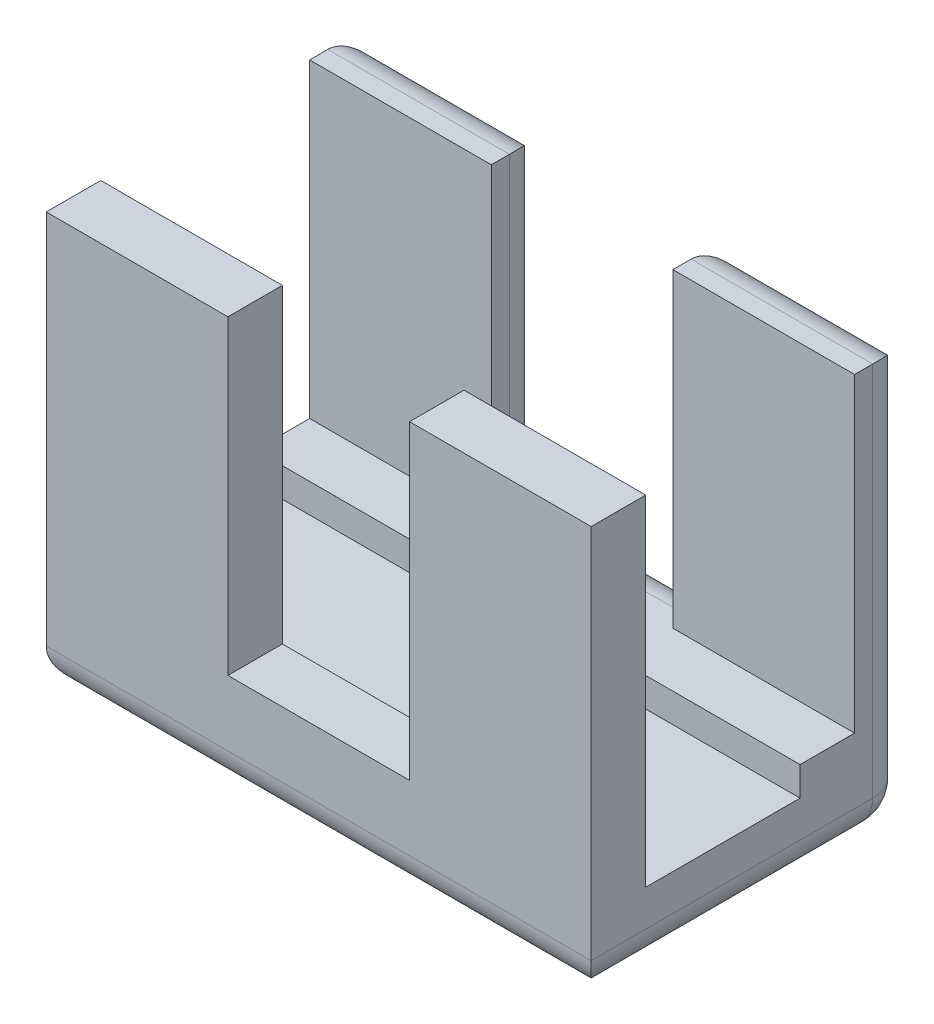
ISO-10303-21;
HEADER;
FILE_DESCRIPTION(('STEP AP214'),'2;1');
FILE_NAME('part.step','',(''),(''),'','','');
FILE_SCHEMA(('AUTOMOTIVE_DESIGN { 1 0 10303 214 1 1 1 1 }'));
ENDSEC;
DATA;
#1=APPLICATION_CONTEXT('core data for automotive mechanical design processes');
#2=APPLICATION_PROTOCOL_DEFINITION('international standard','automotive_design',2000,#1);
#3=PRODUCT_CONTEXT('',#1,'mechanical');
#4=PRODUCT('Part','Part','',(#3));
#5=PRODUCT_RELATED_PRODUCT_CATEGORY('part','',(#4));
#6=PRODUCT_DEFINITION_FORMATION('','',#4);
#7=PRODUCT_DEFINITION_CONTEXT('part definition',#1,'design');
#8=PRODUCT_DEFINITION('design','',#6,#7);
#9=PRODUCT_DEFINITION_SHAPE('','',#8);
#10=(LENGTH_UNIT() NAMED_UNIT(*) SI_UNIT(.MILLI.,.METRE.));
#11=(NAMED_UNIT(*) PLANE_ANGLE_UNIT() SI_UNIT($,.RADIAN.));
#12=(NAMED_UNIT(*) SI_UNIT($,.STERADIAN.) SOLID_ANGLE_UNIT());
#13=UNCERTAINTY_MEASURE_WITH_UNIT(LENGTH_MEASURE(1.E-05),#10,'distance_accuracy_value','');
#14=(GEOMETRIC_REPRESENTATION_CONTEXT(3) GLOBAL_UNCERTAINTY_ASSIGNED_CONTEXT((#13)) GLOBAL_UNIT_ASSIGNED_CONTEXT((#10,
#11,#12)) REPRESENTATION_CONTEXT('',''));
#15=CARTESIAN_POINT('',(0.,0.,0.));
#16=DIRECTION('',(0.,0.,1.));
#17=DIRECTION('',(1.,0.,0.));
#18=AXIS2_PLACEMENT_3D('',#15,#16,#17);
#19=CARTESIAN_POINT('',(0.,4.,0.));
#20=DIRECTION('',(0.,-1.,0.));
#21=DIRECTION('',(0.,0.,-1.));
#22=AXIS2_PLACEMENT_3D('',#19,#20,#21);
#23=PLANE('',#22);
#24=DIRECTION('',(-1.,0.,0.));
#25=VECTOR('',#24,1.);
#26=CARTESIAN_POINT('',(0.,4.,-3.));
#27=LINE('',#26,#25);
#28=CARTESIAN_POINT('',(30.,4.,-3.));
#29=VERTEX_POINT('',#28);
#30=CARTESIAN_POINT('',(0.,4.,-3.));
#31=VERTEX_POINT('',#30);
#32=EDGE_CURVE('E389',#29,#31,#27,.T.);
#33=ORIENTED_EDGE('',*,*,#32,.F.);
#34=DIRECTION('',(0.,0.,-1.));
#35=VECTOR('',#34,1.);
#36=CARTESIAN_POINT('',(30.,4.,0.));
#37=LINE('',#36,#35);
#38=CARTESIAN_POINT('',(30.,4.,-11.5));
#39=VERTEX_POINT('',#38);
#40=EDGE_CURVE('E242',#29,#39,#37,.T.);
#41=ORIENTED_EDGE('',*,*,#40,.T.);
#42=DIRECTION('',(1.,0.,0.));
#43=VECTOR('',#42,1.);
#44=CARTESIAN_POINT('',(0.,4.,-11.5));
#45=LINE('',#44,#43);
#46=CARTESIAN_POINT('',(0.,4.,-11.5));
#47=VERTEX_POINT('',#46);
#48=EDGE_CURVE('E219',#47,#39,#45,.T.);
#49=ORIENTED_EDGE('',*,*,#48,.F.);
#50=DIRECTION('',(0.,0.,1.));
#51=VECTOR('',#50,1.);
#52=CARTESIAN_POINT('',(0.,4.,0.));
#53=LINE('',#52,#51);
#54=EDGE_CURVE('E240',#47,#31,#53,.T.);
#55=ORIENTED_EDGE('',*,*,#54,.T.);
#56=EDGE_LOOP('',(#33,#41,#49,#55));
#57=FACE_BOUND('',#56,.T.);
#58=ADVANCED_FACE('F33',(#57),#23,.F.);
#59=CARTESIAN_POINT('',(0.,5.601,0.));
#60=DIRECTION('',(0.,1.,0.));
#61=DIRECTION('',(0.,0.,1.));
#62=AXIS2_PLACEMENT_3D('',#59,#60,#61);
#63=PLANE('',#62);
#64=DIRECTION('',(0.,0.,1.));
#65=VECTOR('',#64,1.);
#66=CARTESIAN_POINT('',(20.,5.601,-17.5));
#67=LINE('',#66,#65);
#68=CARTESIAN_POINT('',(20.,5.601,-15.5));
#69=VERTEX_POINT('',#68);
#70=CARTESIAN_POINT('',(20.,5.601,-14.5));
#71=VERTEX_POINT('',#70);
#72=EDGE_CURVE('E429',#69,#71,#67,.T.);
#73=ORIENTED_EDGE('',*,*,#72,.F.);
#74=DIRECTION('',(-1.,0.,0.));
#75=VECTOR('',#74,1.);
#76=CARTESIAN_POINT('',(10.,5.601,-15.5));
#77=LINE('',#76,#75);
#78=CARTESIAN_POINT('',(10.,5.601,-15.5));
#79=VERTEX_POINT('',#78);
#80=EDGE_CURVE('E275',#69,#79,#77,.T.);
#81=ORIENTED_EDGE('',*,*,#80,.T.);
#82=DIRECTION('',(0.,0.,-1.));
#83=VECTOR('',#82,1.);
#84=CARTESIAN_POINT('',(10.,5.601,-17.5));
#85=LINE('',#84,#83);
#86=CARTESIAN_POINT('',(10.,5.601,-14.5));
#87=VERTEX_POINT('',#86);
#88=EDGE_CURVE('E355',#87,#79,#85,.T.);
#89=ORIENTED_EDGE('',*,*,#88,.F.);
#90=DIRECTION('',(1.,0.,0.));
#91=VECTOR('',#90,1.);
#92=CARTESIAN_POINT('',(0.,5.601,-14.5));
#93=LINE('',#92,#91);
#94=CARTESIAN_POINT('',(0.,5.601,-14.5));
#95=VERTEX_POINT('',#94);
#96=EDGE_CURVE('E359',#95,#87,#93,.T.);
#97=ORIENTED_EDGE('',*,*,#96,.F.);
#98=DIRECTION('',(0.,0.,1.));
#99=VECTOR('',#98,1.);
#100=CARTESIAN_POINT('',(0.,5.601,-17.5));
#101=LINE('',#100,#99);
#102=CARTESIAN_POINT('',(0.,5.601,-11.5));
#103=VERTEX_POINT('',#102);
#104=EDGE_CURVE('E223',#95,#103,#101,.T.);
#105=ORIENTED_EDGE('',*,*,#104,.T.);
#106=DIRECTION('',(1.,0.,0.));
#107=VECTOR('',#106,1.);
#108=CARTESIAN_POINT('',(0.,5.601,-11.5));
#109=LINE('',#108,#107);
#110=CARTESIAN_POINT('',(30.,5.601,-11.5));
#111=VERTEX_POINT('',#110);
#112=EDGE_CURVE('E230',#103,#111,#109,.T.);
#113=ORIENTED_EDGE('',*,*,#112,.T.);
#114=DIRECTION('',(0.,0.,-1.));
#115=VECTOR('',#114,1.);
#116=CARTESIAN_POINT('',(30.,5.601,-17.5));
#117=LINE('',#116,#115);
#118=CARTESIAN_POINT('',(30.,5.601,-14.5));
#119=VERTEX_POINT('',#118);
#120=EDGE_CURVE('E232',#111,#119,#117,.T.);
#121=ORIENTED_EDGE('',*,*,#120,.T.);
#122=DIRECTION('',(1.,0.,0.));
#123=VECTOR('',#122,1.);
#124=CARTESIAN_POINT('',(30.,5.601,-14.5));
#125=LINE('',#124,#123);
#126=EDGE_CURVE('E475',#71,#119,#125,.T.);
#127=ORIENTED_EDGE('',*,*,#126,.F.);
#128=EDGE_LOOP('',(#73,#81,#89,#97,#105,#113,#121,#127));
#129=FACE_BOUND('',#128,.T.);
#130=ADVANCED_FACE('F426',(#129),#63,.T.);
#131=CARTESIAN_POINT('',(0.,4.,0.));
#132=DIRECTION('',(1.,0.,0.));
#133=DIRECTION('',(0.,0.,-1.));
#134=AXIS2_PLACEMENT_3D('',#131,#132,#133);
#135=PLANE('',#134);
#136=DIRECTION('',(0.,0.,1.));
#137=VECTOR('',#136,1.);
#138=CARTESIAN_POINT('',(0.,22.7,-17.5));
#139=LINE('',#138,#137);
#140=CARTESIAN_POINT('',(0.,22.7,-15.5));
#141=VERTEX_POINT('',#140);
#142=CARTESIAN_POINT('',(0.,22.7,-14.5));
#143=VERTEX_POINT('',#142);
#144=EDGE_CURVE('E343',#141,#143,#139,.T.);
#145=ORIENTED_EDGE('',*,*,#144,.F.);
#146=DIRECTION('',(0.,-1.,0.));
#147=VECTOR('',#146,1.);
#148=CARTESIAN_POINT('',(0.,4.,-15.5));
#149=LINE('',#148,#147);
#150=CARTESIAN_POINT('',(0.,2.,-15.5));
#151=VERTEX_POINT('',#150);
#152=EDGE_CURVE('E283',#141,#151,#149,.T.);
#153=ORIENTED_EDGE('',*,*,#152,.T.);
#154=DIRECTION('',(0.,0.,1.));
#155=VECTOR('',#154,1.);
#156=CARTESIAN_POINT('',(0.,2.,0.));
#157=LINE('',#156,#155);
#158=CARTESIAN_POINT('',(0.,2.,0.));
#159=VERTEX_POINT('',#158);
#160=EDGE_CURVE('E281',#151,#159,#157,.T.);
#161=ORIENTED_EDGE('',*,*,#160,.T.);
#162=DIRECTION('',(0.,-1.,0.));
#163=VECTOR('',#162,1.);
#164=CARTESIAN_POINT('',(0.,4.,0.));
#165=LINE('',#164,#163);
#166=CARTESIAN_POINT('',(0.,22.7,0.));
#167=VERTEX_POINT('',#166);
#168=EDGE_CURVE('E247',#167,#159,#165,.T.);
#169=ORIENTED_EDGE('',*,*,#168,.F.);
#170=DIRECTION('',(0.,0.,1.));
#171=VECTOR('',#170,1.);
#172=CARTESIAN_POINT('',(0.,22.7,0.));
#173=LINE('',#172,#171);
#174=CARTESIAN_POINT('',(0.,22.7,-3.));
#175=VERTEX_POINT('',#174);
#176=EDGE_CURVE('E390',#175,#167,#173,.T.);
#177=ORIENTED_EDGE('',*,*,#176,.F.);
#178=DIRECTION('',(0.,-1.,0.));
#179=VECTOR('',#178,1.);
#180=CARTESIAN_POINT('',(0.,22.7,-3.));
#181=LINE('',#180,#179);
#182=EDGE_CURVE('E225',#175,#31,#181,.T.);
#183=ORIENTED_EDGE('',*,*,#182,.T.);
#184=ORIENTED_EDGE('',*,*,#54,.F.);
#185=DIRECTION('',(0.,-1.,0.));
#186=VECTOR('',#185,1.);
#187=CARTESIAN_POINT('',(0.,5.601,-11.5));
#188=LINE('',#187,#186);
#189=EDGE_CURVE('E237',#103,#47,#188,.T.);
#190=ORIENTED_EDGE('',*,*,#189,.F.);
#191=ORIENTED_EDGE('',*,*,#104,.F.);
#192=DIRECTION('',(0.,-1.,0.));
#193=VECTOR('',#192,1.);
#194=CARTESIAN_POINT('',(0.,22.7,-14.5));
#195=LINE('',#194,#193);
#196=EDGE_CURVE('E353',#143,#95,#195,.T.);
#197=ORIENTED_EDGE('',*,*,#196,.F.);
#198=EDGE_LOOP('',(#145,#153,#161,#169,#177,#183,#184,#190,#191,#197));
#199=FACE_BOUND('',#198,.T.);
#200=ADVANCED_FACE('F349',(#199),#135,.F.);
#201=CARTESIAN_POINT('',(0.,4.,0.));
#202=DIRECTION('',(0.,0.,-1.));
#203=DIRECTION('',(-1.,0.,0.));
#204=AXIS2_PLACEMENT_3D('',#201,#202,#203);
#205=PLANE('',#204);
#206=ORIENTED_EDGE('',*,*,#168,.T.);
#207=DIRECTION('',(1.,0.,0.));
#208=VECTOR('',#207,1.);
#209=CARTESIAN_POINT('',(30.,2.,0.));
#210=LINE('',#209,#208);
#211=CARTESIAN_POINT('',(30.,2.,0.));
#212=VERTEX_POINT('',#211);
#213=EDGE_CURVE('E285',#159,#212,#210,.T.);
#214=ORIENTED_EDGE('',*,*,#213,.T.);
#215=DIRECTION('',(0.,-1.,0.));
#216=VECTOR('',#215,1.);
#217=CARTESIAN_POINT('',(30.,4.,0.));
#218=LINE('',#217,#216);
#219=CARTESIAN_POINT('',(30.,22.7,0.));
#220=VERTEX_POINT('',#219);
#221=EDGE_CURVE('E244',#220,#212,#218,.T.);
#222=ORIENTED_EDGE('',*,*,#221,.F.);
#223=DIRECTION('',(1.,0.,0.));
#224=VECTOR('',#223,1.);
#225=CARTESIAN_POINT('',(30.,22.7,0.));
#226=LINE('',#225,#224);
#227=CARTESIAN_POINT('',(20.,22.7,0.));
#228=VERTEX_POINT('',#227);
#229=EDGE_CURVE('E379',#228,#220,#226,.T.);
#230=ORIENTED_EDGE('',*,*,#229,.F.);
#231=DIRECTION('',(0.,-1.,0.));
#232=VECTOR('',#231,1.);
#233=CARTESIAN_POINT('',(20.,22.7,0.));
#234=LINE('',#233,#232);
#235=CARTESIAN_POINT('',(20.,5.601,0.));
#236=VERTEX_POINT('',#235);
#237=EDGE_CURVE('E203',#228,#236,#234,.T.);
#238=ORIENTED_EDGE('',*,*,#237,.T.);
#239=DIRECTION('',(1.,0.,0.));
#240=VECTOR('',#239,1.);
#241=CARTESIAN_POINT('',(10.,5.601,0.));
#242=LINE('',#241,#240);
#243=CARTESIAN_POINT('',(10.,5.601,0.));
#244=VERTEX_POINT('',#243);
#245=EDGE_CURVE('E193',#244,#236,#242,.T.);
#246=ORIENTED_EDGE('',*,*,#245,.F.);
#247=DIRECTION('',(0.,-1.,0.));
#248=VECTOR('',#247,1.);
#249=CARTESIAN_POINT('',(10.,22.7,0.));
#250=LINE('',#249,#248);
#251=CARTESIAN_POINT('',(10.,22.7,0.));
#252=VERTEX_POINT('',#251);
#253=EDGE_CURVE('E199',#252,#244,#250,.T.);
#254=ORIENTED_EDGE('',*,*,#253,.F.);
#255=DIRECTION('',(1.,0.,0.));
#256=VECTOR('',#255,1.);
#257=CARTESIAN_POINT('',(0.,22.7,0.));
#258=LINE('',#257,#256);
#259=EDGE_CURVE('E393',#167,#252,#258,.T.);
#260=ORIENTED_EDGE('',*,*,#259,.F.);
#261=EDGE_LOOP('',(#206,#214,#222,#230,#238,#246,#254,#260));
#262=FACE_BOUND('',#261,.T.);
#263=ADVANCED_FACE('F196',(#262),#205,.F.);
#264=CARTESIAN_POINT('',(30.,4.,0.));
#265=DIRECTION('',(-1.,0.,0.));
#266=DIRECTION('',(0.,0.,1.));
#267=AXIS2_PLACEMENT_3D('',#264,#265,#266);
#268=PLANE('',#267);
#269=DIRECTION('',(0.,0.,-1.));
#270=VECTOR('',#269,1.);
#271=CARTESIAN_POINT('',(30.,2.,-17.5));
#272=LINE('',#271,#270);
#273=CARTESIAN_POINT('',(30.,2.,-15.5));
#274=VERTEX_POINT('',#273);
#275=EDGE_CURVE('E266',#212,#274,#272,.T.);
#276=ORIENTED_EDGE('',*,*,#275,.T.);
#277=DIRECTION('',(0.,-1.,0.));
#278=VECTOR('',#277,1.);
#279=CARTESIAN_POINT('',(30.,4.,-15.5));
#280=LINE('',#279,#278);
#281=CARTESIAN_POINT('',(30.,22.7,-15.5));
#282=VERTEX_POINT('',#281);
#283=EDGE_CURVE('E268',#274,#282,#280,.F.);
#284=ORIENTED_EDGE('',*,*,#283,.T.);
#285=DIRECTION('',(0.,0.,-1.));
#286=VECTOR('',#285,1.);
#287=CARTESIAN_POINT('',(30.,22.7,-17.5));
#288=LINE('',#287,#286);
#289=CARTESIAN_POINT('',(30.,22.7,-14.5));
#290=VERTEX_POINT('',#289);
#291=EDGE_CURVE('E467',#290,#282,#288,.T.);
#292=ORIENTED_EDGE('',*,*,#291,.F.);
#293=DIRECTION('',(0.,-1.,0.));
#294=VECTOR('',#293,1.);
#295=CARTESIAN_POINT('',(30.,22.7,-14.5));
#296=LINE('',#295,#294);
#297=EDGE_CURVE('E484',#290,#119,#296,.T.);
#298=ORIENTED_EDGE('',*,*,#297,.T.);
#299=ORIENTED_EDGE('',*,*,#120,.F.);
#300=DIRECTION('',(0.,-1.,0.));
#301=VECTOR('',#300,1.);
#302=CARTESIAN_POINT('',(30.,5.601,-11.5));
#303=LINE('',#302,#301);
#304=EDGE_CURVE('E233',#111,#39,#303,.T.);
#305=ORIENTED_EDGE('',*,*,#304,.T.);
#306=ORIENTED_EDGE('',*,*,#40,.F.);
#307=DIRECTION('',(0.,-1.,0.));
#308=VECTOR('',#307,1.);
#309=CARTESIAN_POINT('',(30.,22.7,-3.));
#310=LINE('',#309,#308);
#311=CARTESIAN_POINT('',(30.,22.7,-3.));
#312=VERTEX_POINT('',#311);
#313=EDGE_CURVE('E386',#312,#29,#310,.T.);
#314=ORIENTED_EDGE('',*,*,#313,.F.);
#315=DIRECTION('',(0.,0.,-1.));
#316=VECTOR('',#315,1.);
#317=CARTESIAN_POINT('',(30.,22.7,0.));
#318=LINE('',#317,#316);
#319=EDGE_CURVE('E372',#220,#312,#318,.T.);
#320=ORIENTED_EDGE('',*,*,#319,.F.);
#321=ORIENTED_EDGE('',*,*,#221,.T.);
#322=EDGE_LOOP('',(#276,#284,#292,#298,#299,#305,#306,#314,#320,#321));
#323=FACE_BOUND('',#322,.T.);
#324=ADVANCED_FACE('F411',(#323),#268,.F.);
#325=CARTESIAN_POINT('',(0.,4.,-17.5));
#326=DIRECTION('',(0.,0.,1.));
#327=DIRECTION('',(1.,0.,0.));
#328=AXIS2_PLACEMENT_3D('',#325,#326,#327);
#329=PLANE('',#328);
#330=DIRECTION('',(-1.,0.,0.));
#331=VECTOR('',#330,1.);
#332=CARTESIAN_POINT('',(0.,20.7,-17.5));
#333=LINE('',#332,#331);
#334=CARTESIAN_POINT('',(22.,20.7,-17.5));
#335=VERTEX_POINT('',#334);
#336=CARTESIAN_POINT('',(28.,20.7,-17.5));
#337=VERTEX_POINT('',#336);
#338=EDGE_CURVE('E261',#335,#337,#333,.F.);
#339=ORIENTED_EDGE('',*,*,#338,.T.);
#340=DIRECTION('',(0.,-1.,0.));
#341=VECTOR('',#340,1.);
#342=CARTESIAN_POINT('',(28.,4.,-17.5));
#343=LINE('',#342,#341);
#344=CARTESIAN_POINT('',(28.,2.,-17.5));
#345=VERTEX_POINT('',#344);
#346=EDGE_CURVE('E263',#337,#345,#343,.T.);
#347=ORIENTED_EDGE('',*,*,#346,.T.);
#348=DIRECTION('',(-1.,0.,0.));
#349=VECTOR('',#348,1.);
#350=CARTESIAN_POINT('',(0.,2.,-17.5));
#351=LINE('',#350,#349);
#352=CARTESIAN_POINT('',(2.,2.,-17.5));
#353=VERTEX_POINT('',#352);
#354=EDGE_CURVE('E249',#345,#353,#351,.T.);
#355=ORIENTED_EDGE('',*,*,#354,.T.);
#356=DIRECTION('',(0.,-1.,0.));
#357=VECTOR('',#356,1.);
#358=CARTESIAN_POINT('',(2.,4.,-17.5));
#359=LINE('',#358,#357);
#360=CARTESIAN_POINT('',(2.,20.7,-17.5));
#361=VERTEX_POINT('',#360);
#362=EDGE_CURVE('E251',#353,#361,#359,.F.);
#363=ORIENTED_EDGE('',*,*,#362,.T.);
#364=DIRECTION('',(-1.,0.,0.));
#365=VECTOR('',#364,1.);
#366=CARTESIAN_POINT('',(10.,20.7,-17.5));
#367=LINE('',#366,#365);
#368=CARTESIAN_POINT('',(8.,20.7,-17.5));
#369=VERTEX_POINT('',#368);
#370=EDGE_CURVE('E253',#361,#369,#367,.F.);
#371=ORIENTED_EDGE('',*,*,#370,.T.);
#372=DIRECTION('',(0.,-1.,0.));
#373=VECTOR('',#372,1.);
#374=CARTESIAN_POINT('',(8.,4.,-17.5));
#375=LINE('',#374,#373);
#376=CARTESIAN_POINT('',(8.,3.601,-17.5));
#377=VERTEX_POINT('',#376);
#378=EDGE_CURVE('E255',#369,#377,#375,.T.);
#379=ORIENTED_EDGE('',*,*,#378,.T.);
#380=DIRECTION('',(-1.,0.,0.));
#381=VECTOR('',#380,1.);
#382=CARTESIAN_POINT('',(20.,3.601,-17.5));
#383=LINE('',#382,#381);
#384=CARTESIAN_POINT('',(22.,3.601,-17.5));
#385=VERTEX_POINT('',#384);
#386=EDGE_CURVE('E257',#377,#385,#383,.F.);
#387=ORIENTED_EDGE('',*,*,#386,.T.);
#388=DIRECTION('',(0.,-1.,0.));
#389=VECTOR('',#388,1.);
#390=CARTESIAN_POINT('',(22.,4.,-17.5));
#391=LINE('',#390,#389);
#392=EDGE_CURVE('E259',#385,#335,#391,.F.);
#393=ORIENTED_EDGE('',*,*,#392,.T.);
#394=EDGE_LOOP('',(#339,#347,#355,#363,#371,#379,#387,#393));
#395=FACE_BOUND('',#394,.T.);
#396=ADVANCED_FACE('F441',(#395),#329,.F.);
#397=CARTESIAN_POINT('',(0.,0.,0.));
#398=DIRECTION('',(0.,-1.,0.));
#399=DIRECTION('',(0.,0.,-1.));
#400=AXIS2_PLACEMENT_3D('',#397,#398,#399);
#401=PLANE('',#400);
#402=DIRECTION('',(0.,0.,-1.));
#403=VECTOR('',#402,1.);
#404=CARTESIAN_POINT('',(28.,0.,0.));
#405=LINE('',#404,#403);
#406=CARTESIAN_POINT('',(28.,0.,-15.5));
#407=VERTEX_POINT('',#406);
#408=CARTESIAN_POINT('',(28.,0.,-2.));
#409=VERTEX_POINT('',#408);
#410=EDGE_CURVE('E42',#407,#409,#405,.F.);
#411=ORIENTED_EDGE('',*,*,#410,.T.);
#412=DIRECTION('',(1.,0.,0.));
#413=VECTOR('',#412,1.);
#414=CARTESIAN_POINT('',(0.,0.,-2.));
#415=LINE('',#414,#413);
#416=CARTESIAN_POINT('',(2.,0.,-2.));
#417=VERTEX_POINT('',#416);
#418=EDGE_CURVE('E11',#409,#417,#415,.F.);
#419=ORIENTED_EDGE('',*,*,#418,.T.);
#420=DIRECTION('',(0.,0.,1.));
#421=VECTOR('',#420,1.);
#422=CARTESIAN_POINT('',(2.,0.,-17.5));
#423=LINE('',#422,#421);
#424=CARTESIAN_POINT('',(2.,0.,-15.5));
#425=VERTEX_POINT('',#424);
#426=EDGE_CURVE('E287',#417,#425,#423,.F.);
#427=ORIENTED_EDGE('',*,*,#426,.T.);
#428=DIRECTION('',(-1.,0.,0.));
#429=VECTOR('',#428,1.);
#430=CARTESIAN_POINT('',(30.,0.,-15.5));
#431=LINE('',#430,#429);
#432=EDGE_CURVE('E53',#425,#407,#431,.F.);
#433=ORIENTED_EDGE('',*,*,#432,.T.);
#434=EDGE_LOOP('',(#411,#419,#427,#433));
#435=FACE_BOUND('',#434,.T.);
#436=ADVANCED_FACE('F510',(#435),#401,.T.);
#437=CARTESIAN_POINT('',(0.,5.601,-11.5));
#438=DIRECTION('',(0.,0.,-1.));
#439=DIRECTION('',(-1.,0.,0.));
#440=AXIS2_PLACEMENT_3D('',#437,#438,#439);
#441=PLANE('',#440);
#442=ORIENTED_EDGE('',*,*,#48,.T.);
#443=ORIENTED_EDGE('',*,*,#304,.F.);
#444=ORIENTED_EDGE('',*,*,#112,.F.);
#445=ORIENTED_EDGE('',*,*,#189,.T.);
#446=EDGE_LOOP('',(#442,#443,#444,#445));
#447=FACE_BOUND('',#446,.T.);
#448=ADVANCED_FACE('F418',(#447),#441,.F.);
#449=CARTESIAN_POINT('',(10.,22.7,0.));
#450=DIRECTION('',(-1.,0.,0.));
#451=DIRECTION('',(0.,0.,1.));
#452=AXIS2_PLACEMENT_3D('',#449,#450,#451);
#453=PLANE('',#452);
#454=ORIENTED_EDGE('',*,*,#253,.T.);
#455=DIRECTION('',(0.,0.,1.));
#456=VECTOR('',#455,1.);
#457=CARTESIAN_POINT('',(10.,5.601,-3.));
#458=LINE('',#457,#456);
#459=CARTESIAN_POINT('',(10.,5.601,-3.));
#460=VERTEX_POINT('',#459);
#461=EDGE_CURVE('E207',#460,#244,#458,.T.);
#462=ORIENTED_EDGE('',*,*,#461,.F.);
#463=DIRECTION('',(0.,-1.,0.));
#464=VECTOR('',#463,1.);
#465=CARTESIAN_POINT('',(10.,22.7,-3.));
#466=LINE('',#465,#464);
#467=CARTESIAN_POINT('',(10.,22.7,-3.));
#468=VERTEX_POINT('',#467);
#469=EDGE_CURVE('E220',#468,#460,#466,.T.);
#470=ORIENTED_EDGE('',*,*,#469,.F.);
#471=DIRECTION('',(0.,0.,-1.));
#472=VECTOR('',#471,1.);
#473=CARTESIAN_POINT('',(10.,22.7,0.));
#474=LINE('',#473,#472);
#475=EDGE_CURVE('E218',#252,#468,#474,.T.);
#476=ORIENTED_EDGE('',*,*,#475,.F.);
#477=EDGE_LOOP('',(#454,#462,#470,#476));
#478=FACE_BOUND('',#477,.T.);
#479=ADVANCED_FACE('F217',(#478),#453,.F.);
#480=CARTESIAN_POINT('',(0.,22.7,-3.));
#481=DIRECTION('',(0.,0.,1.));
#482=DIRECTION('',(1.,0.,0.));
#483=AXIS2_PLACEMENT_3D('',#480,#481,#482);
#484=PLANE('',#483);
#485=ORIENTED_EDGE('',*,*,#32,.T.);
#486=ORIENTED_EDGE('',*,*,#182,.F.);
#487=DIRECTION('',(-1.,0.,0.));
#488=VECTOR('',#487,1.);
#489=CARTESIAN_POINT('',(0.,22.7,-3.));
#490=LINE('',#489,#488);
#491=EDGE_CURVE('E396',#468,#175,#490,.T.);
#492=ORIENTED_EDGE('',*,*,#491,.F.);
#493=ORIENTED_EDGE('',*,*,#469,.T.);
#494=DIRECTION('',(-1.,0.,0.));
#495=VECTOR('',#494,1.);
#496=CARTESIAN_POINT('',(10.,5.601,-3.));
#497=LINE('',#496,#495);
#498=CARTESIAN_POINT('',(20.,5.601,-3.));
#499=VERTEX_POINT('',#498);
#500=EDGE_CURVE('E212',#499,#460,#497,.T.);
#501=ORIENTED_EDGE('',*,*,#500,.F.);
#502=DIRECTION('',(0.,-1.,0.));
#503=VECTOR('',#502,1.);
#504=CARTESIAN_POINT('',(20.,22.7,-3.));
#505=LINE('',#504,#503);
#506=CARTESIAN_POINT('',(20.,22.7,-3.));
#507=VERTEX_POINT('',#506);
#508=EDGE_CURVE('E383',#507,#499,#505,.T.);
#509=ORIENTED_EDGE('',*,*,#508,.F.);
#510=DIRECTION('',(-1.,0.,0.));
#511=VECTOR('',#510,1.);
#512=CARTESIAN_POINT('',(30.,22.7,-3.));
#513=LINE('',#512,#511);
#514=EDGE_CURVE('E375',#312,#507,#513,.T.);
#515=ORIENTED_EDGE('',*,*,#514,.F.);
#516=ORIENTED_EDGE('',*,*,#313,.T.);
#517=EDGE_LOOP('',(#485,#486,#492,#493,#501,#509,#515,#516));
#518=FACE_BOUND('',#517,.T.);
#519=ADVANCED_FACE('F406',(#518),#484,.F.);
#520=CARTESIAN_POINT('',(0.,22.7,0.));
#521=DIRECTION('',(0.,-1.,0.));
#522=DIRECTION('',(0.,0.,-1.));
#523=AXIS2_PLACEMENT_3D('',#520,#521,#522);
#524=PLANE('',#523);
#525=ORIENTED_EDGE('',*,*,#176,.T.);
#526=ORIENTED_EDGE('',*,*,#259,.T.);
#527=ORIENTED_EDGE('',*,*,#475,.T.);
#528=ORIENTED_EDGE('',*,*,#491,.T.);
#529=EDGE_LOOP('',(#525,#526,#527,#528));
#530=FACE_BOUND('',#529,.T.);
#531=ADVANCED_FACE('F649',(#530),#524,.F.);
#532=CARTESIAN_POINT('',(20.,22.7,0.));
#533=DIRECTION('',(1.,0.,0.));
#534=DIRECTION('',(0.,0.,-1.));
#535=AXIS2_PLACEMENT_3D('',#532,#533,#534);
#536=PLANE('',#535);
#537=ORIENTED_EDGE('',*,*,#508,.T.);
#538=DIRECTION('',(0.,0.,-1.));
#539=VECTOR('',#538,1.);
#540=CARTESIAN_POINT('',(20.,5.601,-3.));
#541=LINE('',#540,#539);
#542=EDGE_CURVE('E206',#236,#499,#541,.T.);
#543=ORIENTED_EDGE('',*,*,#542,.F.);
#544=ORIENTED_EDGE('',*,*,#237,.F.);
#545=DIRECTION('',(0.,0.,1.));
#546=VECTOR('',#545,1.);
#547=CARTESIAN_POINT('',(20.,22.7,0.));
#548=LINE('',#547,#546);
#549=EDGE_CURVE('E377',#507,#228,#548,.T.);
#550=ORIENTED_EDGE('',*,*,#549,.F.);
#551=EDGE_LOOP('',(#537,#543,#544,#550));
#552=FACE_BOUND('',#551,.T.);
#553=ADVANCED_FACE('F699',(#552),#536,.F.);
#554=CARTESIAN_POINT('',(0.,22.7,0.));
#555=DIRECTION('',(0.,1.,0.));
#556=DIRECTION('',(0.,0.,1.));
#557=AXIS2_PLACEMENT_3D('',#554,#555,#556);
#558=PLANE('',#557);
#559=ORIENTED_EDGE('',*,*,#319,.T.);
#560=ORIENTED_EDGE('',*,*,#514,.T.);
#561=ORIENTED_EDGE('',*,*,#549,.T.);
#562=ORIENTED_EDGE('',*,*,#229,.T.);
#563=EDGE_LOOP('',(#559,#560,#561,#562));
#564=FACE_BOUND('',#563,.T.);
#565=ADVANCED_FACE('F707',(#564),#558,.T.);
#566=CARTESIAN_POINT('',(0.,22.7,-14.5));
#567=DIRECTION('',(0.,0.,-1.));
#568=DIRECTION('',(-1.,0.,0.));
#569=AXIS2_PLACEMENT_3D('',#566,#567,#568);
#570=PLANE('',#569);
#571=ORIENTED_EDGE('',*,*,#96,.T.);
#572=DIRECTION('',(0.,-1.,0.));
#573=VECTOR('',#572,1.);
#574=CARTESIAN_POINT('',(10.,22.7,-14.5));
#575=LINE('',#574,#573);
#576=CARTESIAN_POINT('',(10.,22.7,-14.5));
#577=VERTEX_POINT('',#576);
#578=EDGE_CURVE('E366',#577,#87,#575,.T.);
#579=ORIENTED_EDGE('',*,*,#578,.F.);
#580=DIRECTION('',(1.,0.,0.));
#581=VECTOR('',#580,1.);
#582=CARTESIAN_POINT('',(0.,22.7,-14.5));
#583=LINE('',#582,#581);
#584=EDGE_CURVE('E354',#143,#577,#583,.T.);
#585=ORIENTED_EDGE('',*,*,#584,.F.);
#586=ORIENTED_EDGE('',*,*,#196,.T.);
#587=EDGE_LOOP('',(#571,#579,#585,#586));
#588=FACE_BOUND('',#587,.T.);
#589=ADVANCED_FACE('F421',(#588),#570,.F.);
#590=CARTESIAN_POINT('',(10.,22.7,-17.5));
#591=DIRECTION('',(-1.,0.,0.));
#592=DIRECTION('',(0.,0.,1.));
#593=AXIS2_PLACEMENT_3D('',#590,#591,#592);
#594=PLANE('',#593);
#595=ORIENTED_EDGE('',*,*,#88,.T.);
#596=DIRECTION('',(0.,-1.,0.));
#597=VECTOR('',#596,1.);
#598=CARTESIAN_POINT('',(10.,22.7,-15.5));
#599=LINE('',#598,#597);
#600=CARTESIAN_POINT('',(10.,22.7,-15.5));
#601=VERTEX_POINT('',#600);
#602=EDGE_CURVE('E277',#79,#601,#599,.F.);
#603=ORIENTED_EDGE('',*,*,#602,.T.);
#604=DIRECTION('',(0.,0.,-1.));
#605=VECTOR('',#604,1.);
#606=CARTESIAN_POINT('',(10.,22.7,-17.5));
#607=LINE('',#606,#605);
#608=EDGE_CURVE('E346',#577,#601,#607,.T.);
#609=ORIENTED_EDGE('',*,*,#608,.F.);
#610=ORIENTED_EDGE('',*,*,#578,.T.);
#611=EDGE_LOOP('',(#595,#603,#609,#610));
#612=FACE_BOUND('',#611,.T.);
#613=ADVANCED_FACE('F424',(#612),#594,.F.);
#614=CARTESIAN_POINT('',(0.,22.7,0.));
#615=DIRECTION('',(0.,1.,0.));
#616=DIRECTION('',(0.,0.,1.));
#617=AXIS2_PLACEMENT_3D('',#614,#615,#616);
#618=PLANE('',#617);
#619=ORIENTED_EDGE('',*,*,#608,.T.);
#620=DIRECTION('',(-1.,0.,0.));
#621=VECTOR('',#620,1.);
#622=CARTESIAN_POINT('',(0.,22.7,-15.5));
#623=LINE('',#622,#621);
#624=EDGE_CURVE('E279',#601,#141,#623,.T.);
#625=ORIENTED_EDGE('',*,*,#624,.T.);
#626=ORIENTED_EDGE('',*,*,#144,.T.);
#627=ORIENTED_EDGE('',*,*,#584,.T.);
#628=EDGE_LOOP('',(#619,#625,#626,#627));
#629=FACE_BOUND('',#628,.T.);
#630=ADVANCED_FACE('F342',(#629),#618,.T.);
#631=CARTESIAN_POINT('',(20.,22.7,-17.5));
#632=DIRECTION('',(1.,0.,0.));
#633=DIRECTION('',(0.,0.,-1.));
#634=AXIS2_PLACEMENT_3D('',#631,#632,#633);
#635=PLANE('',#634);
#636=DIRECTION('',(0.,0.,1.));
#637=VECTOR('',#636,1.);
#638=CARTESIAN_POINT('',(20.,22.7,-17.5));
#639=LINE('',#638,#637);
#640=CARTESIAN_POINT('',(20.,22.7,-15.5));
#641=VERTEX_POINT('',#640);
#642=CARTESIAN_POINT('',(20.,22.7,-14.5));
#643=VERTEX_POINT('',#642);
#644=EDGE_CURVE('E474',#641,#643,#639,.T.);
#645=ORIENTED_EDGE('',*,*,#644,.F.);
#646=DIRECTION('',(0.,-1.,0.));
#647=VECTOR('',#646,1.);
#648=CARTESIAN_POINT('',(20.,22.7,-15.5));
#649=LINE('',#648,#647);
#650=EDGE_CURVE('E273',#641,#69,#649,.T.);
#651=ORIENTED_EDGE('',*,*,#650,.T.);
#652=ORIENTED_EDGE('',*,*,#72,.T.);
#653=DIRECTION('',(0.,-1.,0.));
#654=VECTOR('',#653,1.);
#655=CARTESIAN_POINT('',(20.,22.7,-14.5));
#656=LINE('',#655,#654);
#657=EDGE_CURVE('E362',#643,#71,#656,.T.);
#658=ORIENTED_EDGE('',*,*,#657,.F.);
#659=EDGE_LOOP('',(#645,#651,#652,#658));
#660=FACE_BOUND('',#659,.T.);
#661=ADVANCED_FACE('F490',(#660),#635,.F.);
#662=CARTESIAN_POINT('',(30.,22.7,-14.5));
#663=DIRECTION('',(0.,0.,-1.));
#664=DIRECTION('',(-1.,0.,0.));
#665=AXIS2_PLACEMENT_3D('',#662,#663,#664);
#666=PLANE('',#665);
#667=ORIENTED_EDGE('',*,*,#126,.T.);
#668=ORIENTED_EDGE('',*,*,#297,.F.);
#669=DIRECTION('',(1.,0.,0.));
#670=VECTOR('',#669,1.);
#671=CARTESIAN_POINT('',(30.,22.7,-14.5));
#672=LINE('',#671,#670);
#673=EDGE_CURVE('E472',#643,#290,#672,.T.);
#674=ORIENTED_EDGE('',*,*,#673,.F.);
#675=ORIENTED_EDGE('',*,*,#657,.T.);
#676=EDGE_LOOP('',(#667,#668,#674,#675));
#677=FACE_BOUND('',#676,.T.);
#678=ADVANCED_FACE('F488',(#677),#666,.F.);
#679=CARTESIAN_POINT('',(0.,22.7,0.));
#680=DIRECTION('',(0.,-1.,0.));
#681=DIRECTION('',(0.,0.,-1.));
#682=AXIS2_PLACEMENT_3D('',#679,#680,#681);
#683=PLANE('',#682);
#684=ORIENTED_EDGE('',*,*,#291,.T.);
#685=DIRECTION('',(-1.,0.,0.));
#686=VECTOR('',#685,1.);
#687=CARTESIAN_POINT('',(0.,22.7,-15.5));
#688=LINE('',#687,#686);
#689=EDGE_CURVE('E271',#282,#641,#688,.T.);
#690=ORIENTED_EDGE('',*,*,#689,.T.);
#691=ORIENTED_EDGE('',*,*,#644,.T.);
#692=ORIENTED_EDGE('',*,*,#673,.T.);
#693=EDGE_LOOP('',(#684,#690,#691,#692));
#694=FACE_BOUND('',#693,.T.);
#695=ADVANCED_FACE('F469',(#694),#683,.F.);
#696=CARTESIAN_POINT('',(0.,5.601,0.));
#697=DIRECTION('',(0.,1.,0.));
#698=DIRECTION('',(0.,0.,1.));
#699=AXIS2_PLACEMENT_3D('',#696,#697,#698);
#700=PLANE('',#699);
#701=ORIENTED_EDGE('',*,*,#461,.T.);
#702=ORIENTED_EDGE('',*,*,#245,.T.);
#703=ORIENTED_EDGE('',*,*,#542,.T.);
#704=ORIENTED_EDGE('',*,*,#500,.T.);
#705=EDGE_LOOP('',(#701,#702,#703,#704));
#706=FACE_BOUND('',#705,.T.);
#707=ADVANCED_FACE('F210',(#706),#700,.T.);
#708=CARTESIAN_POINT('',(0.,20.7,-15.5));
#709=DIRECTION('',(1.,0.,0.));
#710=DIRECTION('',(0.,0.,-1.));
#711=AXIS2_PLACEMENT_3D('',#708,#709,#710);
#712=CYLINDRICAL_SURFACE('',#711,2.);
#713=CARTESIAN_POINT('',(2.,20.7,-15.5));
#714=DIRECTION('',(-0.707106781186547,-0.707106781186547,0.));
#715=DIRECTION('',(0.707106781186547,-0.707106781186547,0.));
#716=AXIS2_PLACEMENT_3D('',#713,#714,#715);
#717=ELLIPSE('',#716,2.82842712474619,2.);
#718=EDGE_CURVE('E323',#141,#361,#717,.T.);
#719=ORIENTED_EDGE('',*,*,#718,.F.);
#720=ORIENTED_EDGE('',*,*,#624,.F.);
#721=CARTESIAN_POINT('',(8.,20.7,-15.5));
#722=DIRECTION('',(0.707106781186547,-0.707106781186547,0.));
#723=DIRECTION('',(0.707106781186547,0.707106781186547,0.));
#724=AXIS2_PLACEMENT_3D('',#721,#722,#723);
#725=ELLIPSE('',#724,2.82842712474619,2.);
#726=EDGE_CURVE('E37',#369,#601,#725,.T.);
#727=ORIENTED_EDGE('',*,*,#726,.F.);
#728=ORIENTED_EDGE('',*,*,#370,.F.);
#729=EDGE_LOOP('',(#719,#720,#727,#728));
#730=FACE_BOUND('',#729,.T.);
#731=ADVANCED_FACE('F35',(#730),#712,.T.);
#732=CARTESIAN_POINT('',(8.,4.,-15.5));
#733=DIRECTION('',(0.,-1.,0.));
#734=DIRECTION('',(0.,0.,-1.));
#735=AXIS2_PLACEMENT_3D('',#732,#733,#734);
#736=CYLINDRICAL_SURFACE('',#735,2.);
#737=ORIENTED_EDGE('',*,*,#726,.T.);
#738=ORIENTED_EDGE('',*,*,#602,.F.);
#739=CARTESIAN_POINT('',(8.,3.601,-15.5));
#740=DIRECTION('',(0.707106781186547,-0.707106781186547,0.));
#741=DIRECTION('',(0.707106781186547,0.707106781186547,0.));
#742=AXIS2_PLACEMENT_3D('',#739,#740,#741);
#743=ELLIPSE('',#742,2.82842712474619,2.);
#744=EDGE_CURVE('E321',#377,#79,#743,.T.);
#745=ORIENTED_EDGE('',*,*,#744,.F.);
#746=ORIENTED_EDGE('',*,*,#378,.F.);
#747=EDGE_LOOP('',(#737,#738,#745,#746));
#748=FACE_BOUND('',#747,.T.);
#749=ADVANCED_FACE('F334',(#748),#736,.T.);
#750=CARTESIAN_POINT('',(2.,4.,-15.5));
#751=DIRECTION('',(0.,-1.,0.));
#752=DIRECTION('',(0.,0.,-1.));
#753=AXIS2_PLACEMENT_3D('',#750,#751,#752);
#754=CYLINDRICAL_SURFACE('',#753,2.);
#755=ORIENTED_EDGE('',*,*,#718,.T.);
#756=ORIENTED_EDGE('',*,*,#362,.F.);
#757=CARTESIAN_POINT('',(2.,2.,-15.5));
#758=DIRECTION('',(0.,-1.,0.));
#759=DIRECTION('',(0.,0.,-1.));
#760=AXIS2_PLACEMENT_3D('',#757,#758,#759);
#761=CIRCLE('',#760,2.);
#762=EDGE_CURVE('E318',#151,#353,#761,.T.);
#763=ORIENTED_EDGE('',*,*,#762,.F.);
#764=ORIENTED_EDGE('',*,*,#152,.F.);
#765=EDGE_LOOP('',(#755,#756,#763,#764));
#766=FACE_BOUND('',#765,.T.);
#767=ADVANCED_FACE('F445',(#766),#754,.T.);
#768=CARTESIAN_POINT('',(2.,2.,0.));
#769=DIRECTION('',(0.,0.,-1.));
#770=DIRECTION('',(-1.,0.,0.));
#771=AXIS2_PLACEMENT_3D('',#768,#769,#770);
#772=CYLINDRICAL_SURFACE('',#771,2.);
#773=CARTESIAN_POINT('',(2.,2.,-2.));
#774=DIRECTION('',(-0.707106781186548,0.,-0.707106781186547));
#775=DIRECTION('',(0.707106781186547,0.,-0.707106781186548));
#776=AXIS2_PLACEMENT_3D('',#773,#774,#775);
#777=ELLIPSE('',#776,2.82842712474619,2.);
#778=EDGE_CURVE('E313',#159,#417,#777,.F.);
#779=ORIENTED_EDGE('',*,*,#778,.F.);
#780=ORIENTED_EDGE('',*,*,#160,.F.);
#781=CARTESIAN_POINT('',(2.,2.,-15.5));
#782=DIRECTION('',(0.,0.,-1.));
#783=DIRECTION('',(-1.,0.,0.));
#784=AXIS2_PLACEMENT_3D('',#781,#782,#783);
#785=CIRCLE('',#784,2.);
#786=EDGE_CURVE('E315',#425,#151,#785,.T.);
#787=ORIENTED_EDGE('',*,*,#786,.F.);
#788=ORIENTED_EDGE('',*,*,#426,.F.);
#789=EDGE_LOOP('',(#779,#780,#787,#788));
#790=FACE_BOUND('',#789,.T.);
#791=ADVANCED_FACE('F543',(#790),#772,.T.);
#792=CARTESIAN_POINT('',(0.,3.601,-15.5));
#793=DIRECTION('',(1.,0.,0.));
#794=DIRECTION('',(0.,0.,-1.));
#795=AXIS2_PLACEMENT_3D('',#792,#793,#794);
#796=CYLINDRICAL_SURFACE('',#795,2.);
#797=ORIENTED_EDGE('',*,*,#744,.T.);
#798=ORIENTED_EDGE('',*,*,#80,.F.);
#799=CARTESIAN_POINT('',(22.,3.601,-15.5));
#800=DIRECTION('',(-0.707106781186547,-0.707106781186547,0.));
#801=DIRECTION('',(0.707106781186547,-0.707106781186547,0.));
#802=AXIS2_PLACEMENT_3D('',#799,#800,#801);
#803=ELLIPSE('',#802,2.82842712474619,2.);
#804=EDGE_CURVE('E310',#385,#69,#803,.F.);
#805=ORIENTED_EDGE('',*,*,#804,.F.);
#806=ORIENTED_EDGE('',*,*,#386,.F.);
#807=EDGE_LOOP('',(#797,#798,#805,#806));
#808=FACE_BOUND('',#807,.T.);
#809=ADVANCED_FACE('F432',(#808),#796,.T.);
#810=CARTESIAN_POINT('',(2.,2.,-15.5));
#811=DIRECTION('',(0.,0.,1.));
#812=DIRECTION('',(1.,0.,0.));
#813=AXIS2_PLACEMENT_3D('',#810,#811,#812);
#814=SPHERICAL_SURFACE('',#813,2.);
#815=ORIENTED_EDGE('',*,*,#786,.T.);
#816=ORIENTED_EDGE('',*,*,#762,.T.);
#817=CARTESIAN_POINT('',(2.,2.,-15.5));
#818=DIRECTION('',(-1.,0.,0.));
#819=DIRECTION('',(0.,0.,1.));
#820=AXIS2_PLACEMENT_3D('',#817,#818,#819);
#821=CIRCLE('',#820,2.);
#822=EDGE_CURVE('E307',#425,#353,#821,.F.);
#823=ORIENTED_EDGE('',*,*,#822,.F.);
#824=EDGE_LOOP('',(#815,#816,#823));
#825=FACE_BOUND('',#824,.T.);
#826=ADVANCED_FACE('F448',(#825),#814,.T.);
#827=CARTESIAN_POINT('',(0.,2.,-2.));
#828=DIRECTION('',(-1.,0.,0.));
#829=DIRECTION('',(0.,0.,1.));
#830=AXIS2_PLACEMENT_3D('',#827,#828,#829);
#831=CYLINDRICAL_SURFACE('',#830,2.);
#832=ORIENTED_EDGE('',*,*,#778,.T.);
#833=ORIENTED_EDGE('',*,*,#418,.F.);
#834=CARTESIAN_POINT('',(28.,2.,-2.));
#835=DIRECTION('',(-0.707106781186547,0.,0.707106781186548));
#836=DIRECTION('',(0.707106781186548,0.,0.707106781186547));
#837=AXIS2_PLACEMENT_3D('',#834,#835,#836);
#838=ELLIPSE('',#837,2.82842712474619,2.);
#839=EDGE_CURVE('E304',#212,#409,#838,.F.);
#840=ORIENTED_EDGE('',*,*,#839,.F.);
#841=ORIENTED_EDGE('',*,*,#213,.F.);
#842=EDGE_LOOP('',(#832,#833,#840,#841));
#843=FACE_BOUND('',#842,.T.);
#844=ADVANCED_FACE('F535',(#843),#831,.T.);
#845=CARTESIAN_POINT('',(22.,22.7,-15.5));
#846=DIRECTION('',(0.,-1.,0.));
#847=DIRECTION('',(0.,0.,-1.));
#848=AXIS2_PLACEMENT_3D('',#845,#846,#847);
#849=CYLINDRICAL_SURFACE('',#848,2.);
#850=ORIENTED_EDGE('',*,*,#804,.T.);
#851=ORIENTED_EDGE('',*,*,#650,.F.);
#852=CARTESIAN_POINT('',(22.,20.7,-15.5));
#853=DIRECTION('',(-0.707106781186547,-0.707106781186547,0.));
#854=DIRECTION('',(0.707106781186547,-0.707106781186547,0.));
#855=AXIS2_PLACEMENT_3D('',#852,#853,#854);
#856=ELLIPSE('',#855,2.82842712474619,2.);
#857=EDGE_CURVE('E301',#335,#641,#856,.F.);
#858=ORIENTED_EDGE('',*,*,#857,.F.);
#859=ORIENTED_EDGE('',*,*,#392,.F.);
#860=EDGE_LOOP('',(#850,#851,#858,#859));
#861=FACE_BOUND('',#860,.T.);
#862=ADVANCED_FACE('F437',(#861),#849,.T.);
#863=CARTESIAN_POINT('',(0.,2.,-15.5));
#864=DIRECTION('',(1.,0.,0.));
#865=DIRECTION('',(0.,0.,-1.));
#866=AXIS2_PLACEMENT_3D('',#863,#864,#865);
#867=CYLINDRICAL_SURFACE('',#866,2.);
#868=ORIENTED_EDGE('',*,*,#822,.T.);
#869=ORIENTED_EDGE('',*,*,#354,.F.);
#870=CARTESIAN_POINT('',(28.,2.,-15.5));
#871=DIRECTION('',(1.,0.,0.));
#872=DIRECTION('',(0.,0.,-1.));
#873=AXIS2_PLACEMENT_3D('',#870,#871,#872);
#874=CIRCLE('',#873,2.);
#875=EDGE_CURVE('E298',#407,#345,#874,.T.);
#876=ORIENTED_EDGE('',*,*,#875,.F.);
#877=ORIENTED_EDGE('',*,*,#432,.F.);
#878=EDGE_LOOP('',(#868,#869,#876,#877));
#879=FACE_BOUND('',#878,.T.);
#880=ADVANCED_FACE('F451',(#879),#867,.T.);
#881=CARTESIAN_POINT('',(28.,2.,0.));
#882=DIRECTION('',(0.,0.,1.));
#883=DIRECTION('',(1.,0.,0.));
#884=AXIS2_PLACEMENT_3D('',#881,#882,#883);
#885=CYLINDRICAL_SURFACE('',#884,2.);
#886=ORIENTED_EDGE('',*,*,#839,.T.);
#887=ORIENTED_EDGE('',*,*,#410,.F.);
#888=CARTESIAN_POINT('',(28.,2.,-15.5));
#889=DIRECTION('',(0.,0.,-1.));
#890=DIRECTION('',(-1.,0.,0.));
#891=AXIS2_PLACEMENT_3D('',#888,#889,#890);
#892=CIRCLE('',#891,2.);
#893=EDGE_CURVE('E295',#274,#407,#892,.T.);
#894=ORIENTED_EDGE('',*,*,#893,.F.);
#895=ORIENTED_EDGE('',*,*,#275,.F.);
#896=EDGE_LOOP('',(#886,#887,#894,#895));
#897=FACE_BOUND('',#896,.T.);
#898=ADVANCED_FACE('F460',(#897),#885,.T.);
#899=CARTESIAN_POINT('',(0.,20.7,-15.5));
#900=DIRECTION('',(-1.,0.,0.));
#901=DIRECTION('',(0.,0.,1.));
#902=AXIS2_PLACEMENT_3D('',#899,#900,#901);
#903=CYLINDRICAL_SURFACE('',#902,2.);
#904=ORIENTED_EDGE('',*,*,#857,.T.);
#905=ORIENTED_EDGE('',*,*,#689,.F.);
#906=CARTESIAN_POINT('',(28.,20.7,-15.5));
#907=DIRECTION('',(-0.707106781186547,0.707106781186547,0.));
#908=DIRECTION('',(-0.707106781186547,-0.707106781186547,0.));
#909=AXIS2_PLACEMENT_3D('',#906,#907,#908);
#910=ELLIPSE('',#909,2.82842712474619,2.);
#911=EDGE_CURVE('E293',#337,#282,#910,.F.);
#912=ORIENTED_EDGE('',*,*,#911,.F.);
#913=ORIENTED_EDGE('',*,*,#338,.F.);
#914=EDGE_LOOP('',(#904,#905,#912,#913));
#915=FACE_BOUND('',#914,.T.);
#916=ADVANCED_FACE('F525',(#915),#903,.T.);
#917=CARTESIAN_POINT('',(28.,2.,-15.5));
#918=DIRECTION('',(0.,0.,1.));
#919=DIRECTION('',(1.,0.,0.));
#920=AXIS2_PLACEMENT_3D('',#917,#918,#919);
#921=SPHERICAL_SURFACE('',#920,2.);
#922=ORIENTED_EDGE('',*,*,#893,.T.);
#923=ORIENTED_EDGE('',*,*,#875,.T.);
#924=CARTESIAN_POINT('',(28.,2.,-15.5));
#925=DIRECTION('',(0.,-1.,0.));
#926=DIRECTION('',(0.,0.,-1.));
#927=AXIS2_PLACEMENT_3D('',#924,#925,#926);
#928=CIRCLE('',#927,2.);
#929=EDGE_CURVE('E291',#274,#345,#928,.F.);
#930=ORIENTED_EDGE('',*,*,#929,.F.);
#931=EDGE_LOOP('',(#922,#923,#930));
#932=FACE_BOUND('',#931,.T.);
#933=ADVANCED_FACE('F456',(#932),#921,.T.);
#934=CARTESIAN_POINT('',(28.,4.,-15.5));
#935=DIRECTION('',(0.,-1.,0.));
#936=DIRECTION('',(0.,0.,-1.));
#937=AXIS2_PLACEMENT_3D('',#934,#935,#936);
#938=CYLINDRICAL_SURFACE('',#937,2.);
#939=ORIENTED_EDGE('',*,*,#911,.T.);
#940=ORIENTED_EDGE('',*,*,#283,.F.);
#941=ORIENTED_EDGE('',*,*,#929,.T.);
#942=ORIENTED_EDGE('',*,*,#346,.F.);
#943=EDGE_LOOP('',(#939,#940,#941,#942));
#944=FACE_BOUND('',#943,.T.);
#945=ADVANCED_FACE('F462',(#944),#938,.T.);
#946=CLOSED_SHELL('',(#58,#130,#200,#263,#324,#396,#436,#448,#479,#519,#531,#553,#565,#589,#613,
#630,#661,#678,#695,#707,#731,#749,#767,#791,#809,#826,#844,#862,#880,#898,#916,#933,#945));
#947=MANIFOLD_SOLID_BREP('B2',#946);
#948=ADVANCED_BREP_SHAPE_REPRESENTATION('',(#18,#947),#14);
#949=SHAPE_DEFINITION_REPRESENTATION(#9,#948);
ENDSEC;
END-ISO-10303-21;
